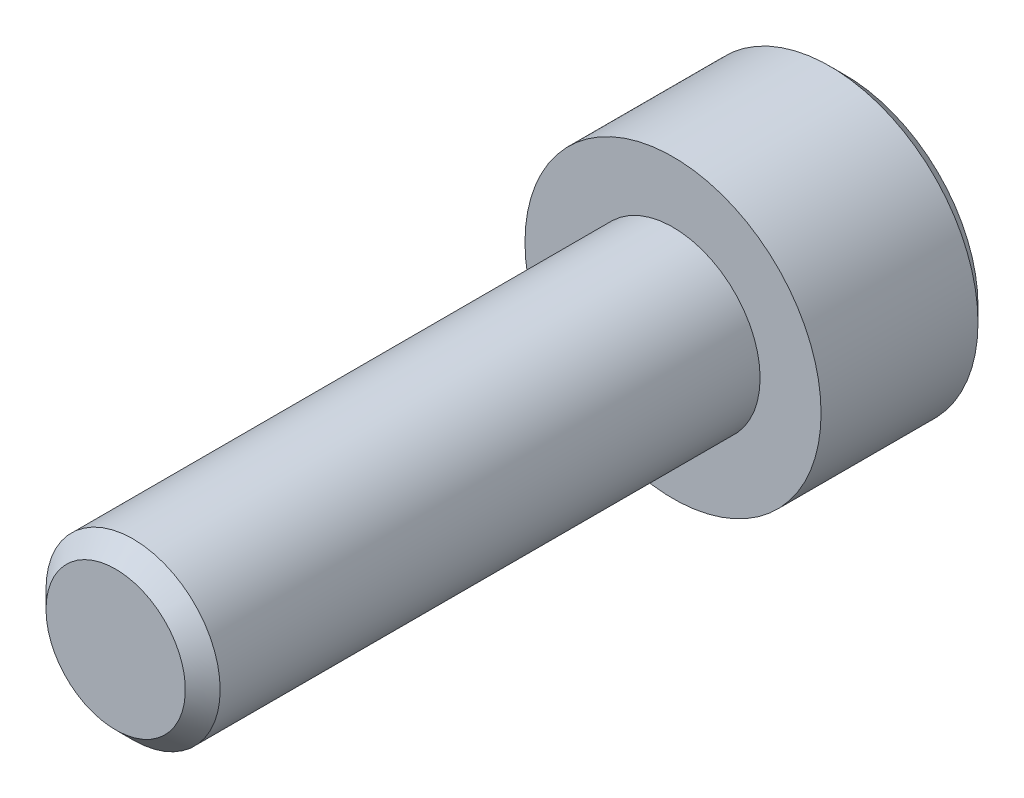
ISO-10303-21;
HEADER;
FILE_DESCRIPTION(('STEP AP214'),'2;1');
FILE_NAME('part.step','',(''),(''),'','','');
FILE_SCHEMA(('AUTOMOTIVE_DESIGN { 1 0 10303 214 1 1 1 1 }'));
ENDSEC;
DATA;
#1=APPLICATION_CONTEXT('core data for automotive mechanical design processes');
#2=APPLICATION_PROTOCOL_DEFINITION('international standard','automotive_design',2000,#1);
#3=PRODUCT_CONTEXT('',#1,'mechanical');
#4=PRODUCT('Part','Part','',(#3));
#5=PRODUCT_RELATED_PRODUCT_CATEGORY('part','',(#4));
#6=PRODUCT_DEFINITION_FORMATION('','',#4);
#7=PRODUCT_DEFINITION_CONTEXT('part definition',#1,'design');
#8=PRODUCT_DEFINITION('design','',#6,#7);
#9=PRODUCT_DEFINITION_SHAPE('','',#8);
#10=(LENGTH_UNIT() NAMED_UNIT(*) SI_UNIT(.MILLI.,.METRE.));
#11=(NAMED_UNIT(*) PLANE_ANGLE_UNIT() SI_UNIT($,.RADIAN.));
#12=(NAMED_UNIT(*) SI_UNIT($,.STERADIAN.) SOLID_ANGLE_UNIT());
#13=UNCERTAINTY_MEASURE_WITH_UNIT(LENGTH_MEASURE(1.E-05),#10,'distance_accuracy_value','');
#14=(GEOMETRIC_REPRESENTATION_CONTEXT(3) GLOBAL_UNCERTAINTY_ASSIGNED_CONTEXT((#13)) GLOBAL_UNIT_ASSIGNED_CONTEXT((#10,
#11,#12)) REPRESENTATION_CONTEXT('',''));
#15=CARTESIAN_POINT('',(0.,0.,0.));
#16=DIRECTION('',(0.,0.,1.));
#17=DIRECTION('',(1.,0.,0.));
#18=AXIS2_PLACEMENT_3D('',#15,#16,#17);
#19=CARTESIAN_POINT('',(0.,0.,-2.43));
#20=DIRECTION('',(0.,0.,1.));
#21=DIRECTION('',(1.,0.,0.));
#22=AXIS2_PLACEMENT_3D('',#19,#20,#21);
#23=PLANE('',#22);
#24=DIRECTION('',(0.,1.,0.));
#25=VECTOR('',#24,1.);
#26=CARTESIAN_POINT('',(2.,1.15470053837925,-2.43));
#27=LINE('',#26,#25);
#28=CARTESIAN_POINT('',(2.,1.15470053837925,-2.43));
#29=VERTEX_POINT('',#28);
#30=CARTESIAN_POINT('',(2.,-1.15470053837925,-2.43));
#31=VERTEX_POINT('',#30);
#32=EDGE_CURVE('E130',#29,#31,#27,.F.);
#33=ORIENTED_EDGE('',*,*,#32,.T.);
#34=DIRECTION('',(0.866025403784439,0.499999999999999,0.));
#35=VECTOR('',#34,1.);
#36=CARTESIAN_POINT('',(2.,-1.15470053837925,-2.43));
#37=LINE('',#36,#35);
#38=CARTESIAN_POINT('',(0.,-2.3094010767585,-2.43));
#39=VERTEX_POINT('',#38);
#40=EDGE_CURVE('E125',#31,#39,#37,.F.);
#41=ORIENTED_EDGE('',*,*,#40,.T.);
#42=DIRECTION('',(0.866025403784438,-0.5,0.));
#43=VECTOR('',#42,1.);
#44=CARTESIAN_POINT('',(0.,-2.3094010767585,-2.43));
#45=LINE('',#44,#43);
#46=CARTESIAN_POINT('',(-2.,-1.15470053837925,-2.43));
#47=VERTEX_POINT('',#46);
#48=EDGE_CURVE('E74',#39,#47,#45,.F.);
#49=ORIENTED_EDGE('',*,*,#48,.T.);
#50=DIRECTION('',(0.,1.,0.));
#51=VECTOR('',#50,1.);
#52=CARTESIAN_POINT('',(-2.,-1.15470053837925,-2.43));
#53=LINE('',#52,#51);
#54=CARTESIAN_POINT('',(-2.,1.15470053837925,-2.43));
#55=VERTEX_POINT('',#54);
#56=EDGE_CURVE('E71',#47,#55,#53,.T.);
#57=ORIENTED_EDGE('',*,*,#56,.T.);
#58=DIRECTION('',(-0.866025403784439,-0.5,0.));
#59=VECTOR('',#58,1.);
#60=CARTESIAN_POINT('',(-2.,1.15470053837925,-2.43));
#61=LINE('',#60,#59);
#62=CARTESIAN_POINT('',(0.,2.3094010767585,-2.43));
#63=VERTEX_POINT('',#62);
#64=EDGE_CURVE('E68',#55,#63,#61,.F.);
#65=ORIENTED_EDGE('',*,*,#64,.T.);
#66=DIRECTION('',(-0.866025403784439,0.5,0.));
#67=VECTOR('',#66,1.);
#68=CARTESIAN_POINT('',(0.,2.3094010767585,-2.43));
#69=LINE('',#68,#67);
#70=EDGE_CURVE('E91',#63,#29,#69,.F.);
#71=ORIENTED_EDGE('',*,*,#70,.T.);
#72=EDGE_LOOP('',(#33,#41,#49,#57,#65,#71));
#73=FACE_BOUND('',#72,.T.);
#74=ADVANCED_FACE('F17',(#73),#23,.F.);
#75=CARTESIAN_POINT('',(-2.,-1.15470053837925,-4.93));
#76=DIRECTION('',(-1.,0.,0.));
#77=DIRECTION('',(0.,0.,1.));
#78=AXIS2_PLACEMENT_3D('',#75,#76,#77);
#79=PLANE('',#78);
#80=ORIENTED_EDGE('',*,*,#56,.F.);
#81=DIRECTION('',(0.,0.,1.));
#82=VECTOR('',#81,1.);
#83=CARTESIAN_POINT('',(-2.,-1.15470053837925,-4.93));
#84=LINE('',#83,#82);
#85=CARTESIAN_POINT('',(-2.,-1.15470053837925,-4.93));
#86=VERTEX_POINT('',#85);
#87=EDGE_CURVE('E120',#47,#86,#84,.F.);
#88=ORIENTED_EDGE('',*,*,#87,.T.);
#89=DIRECTION('',(0.,1.,0.));
#90=VECTOR('',#89,1.);
#91=CARTESIAN_POINT('',(-2.,0.,-4.93));
#92=LINE('',#91,#90);
#93=CARTESIAN_POINT('',(-2.,1.15470053837925,-4.93));
#94=VERTEX_POINT('',#93);
#95=EDGE_CURVE('E82',#86,#94,#92,.T.);
#96=ORIENTED_EDGE('',*,*,#95,.T.);
#97=DIRECTION('',(0.,0.,1.));
#98=VECTOR('',#97,1.);
#99=CARTESIAN_POINT('',(-2.,1.15470053837925,-4.93));
#100=LINE('',#99,#98);
#101=EDGE_CURVE('E77',#94,#55,#100,.T.);
#102=ORIENTED_EDGE('',*,*,#101,.T.);
#103=EDGE_LOOP('',(#80,#88,#96,#102));
#104=FACE_BOUND('',#103,.T.);
#105=ADVANCED_FACE('F80',(#104),#79,.F.);
#106=CARTESIAN_POINT('',(-2.,1.15470053837925,-4.93));
#107=DIRECTION('',(-0.5,0.866025403784439,0.));
#108=DIRECTION('',(-0.866025403784439,-0.5,0.));
#109=AXIS2_PLACEMENT_3D('',#106,#107,#108);
#110=PLANE('',#109);
#111=ORIENTED_EDGE('',*,*,#64,.F.);
#112=ORIENTED_EDGE('',*,*,#101,.F.);
#113=DIRECTION('',(0.866025403784439,0.499999999999999,0.));
#114=VECTOR('',#113,1.);
#115=CARTESIAN_POINT('',(-2.,1.15470053837925,-4.93));
#116=LINE('',#115,#114);
#117=CARTESIAN_POINT('',(0.,2.3094010767585,-4.93));
#118=VERTEX_POINT('',#117);
#119=EDGE_CURVE('E117',#94,#118,#116,.T.);
#120=ORIENTED_EDGE('',*,*,#119,.T.);
#121=DIRECTION('',(0.,0.,1.));
#122=VECTOR('',#121,1.);
#123=CARTESIAN_POINT('',(0.,2.3094010767585,-4.93));
#124=LINE('',#123,#122);
#125=EDGE_CURVE('E88',#118,#63,#124,.T.);
#126=ORIENTED_EDGE('',*,*,#125,.T.);
#127=EDGE_LOOP('',(#111,#112,#120,#126));
#128=FACE_BOUND('',#127,.T.);
#129=ADVANCED_FACE('F86',(#128),#110,.F.);
#130=CARTESIAN_POINT('',(0.,2.3094010767585,-4.93));
#131=DIRECTION('',(0.5,0.866025403784439,0.));
#132=DIRECTION('',(-0.866025403784439,0.5,0.));
#133=AXIS2_PLACEMENT_3D('',#130,#131,#132);
#134=PLANE('',#133);
#135=ORIENTED_EDGE('',*,*,#70,.F.);
#136=ORIENTED_EDGE('',*,*,#125,.F.);
#137=DIRECTION('',(0.866025403784439,-0.5,0.));
#138=VECTOR('',#137,1.);
#139=CARTESIAN_POINT('',(0.,2.3094010767585,-4.93));
#140=LINE('',#139,#138);
#141=CARTESIAN_POINT('',(2.,1.15470053837925,-4.93));
#142=VERTEX_POINT('',#141);
#143=EDGE_CURVE('E115',#118,#142,#140,.T.);
#144=ORIENTED_EDGE('',*,*,#143,.T.);
#145=DIRECTION('',(0.,0.,-1.));
#146=VECTOR('',#145,1.);
#147=CARTESIAN_POINT('',(2.,1.15470053837925,-4.93));
#148=LINE('',#147,#146);
#149=EDGE_CURVE('E132',#142,#29,#148,.F.);
#150=ORIENTED_EDGE('',*,*,#149,.T.);
#151=EDGE_LOOP('',(#135,#136,#144,#150));
#152=FACE_BOUND('',#151,.T.);
#153=ADVANCED_FACE('F137',(#152),#134,.F.);
#154=CARTESIAN_POINT('',(2.,1.15470053837925,-4.93));
#155=DIRECTION('',(1.,0.,0.));
#156=DIRECTION('',(0.,0.,-1.));
#157=AXIS2_PLACEMENT_3D('',#154,#155,#156);
#158=PLANE('',#157);
#159=ORIENTED_EDGE('',*,*,#32,.F.);
#160=ORIENTED_EDGE('',*,*,#149,.F.);
#161=DIRECTION('',(0.,1.,0.));
#162=VECTOR('',#161,1.);
#163=CARTESIAN_POINT('',(2.,0.,-4.93));
#164=LINE('',#163,#162);
#165=CARTESIAN_POINT('',(2.,-1.15470053837925,-4.93));
#166=VERTEX_POINT('',#165);
#167=EDGE_CURVE('E113',#142,#166,#164,.F.);
#168=ORIENTED_EDGE('',*,*,#167,.T.);
#169=DIRECTION('',(0.,0.,1.));
#170=VECTOR('',#169,1.);
#171=CARTESIAN_POINT('',(2.,-1.15470053837925,-4.93));
#172=LINE('',#171,#170);
#173=EDGE_CURVE('E127',#166,#31,#172,.T.);
#174=ORIENTED_EDGE('',*,*,#173,.T.);
#175=EDGE_LOOP('',(#159,#160,#168,#174));
#176=FACE_BOUND('',#175,.T.);
#177=ADVANCED_FACE('F141',(#176),#158,.F.);
#178=CARTESIAN_POINT('',(2.,-1.15470053837925,-4.93));
#179=DIRECTION('',(0.499999999999999,-0.866025403784439,0.));
#180=DIRECTION('',(0.866025403784439,0.499999999999999,0.));
#181=AXIS2_PLACEMENT_3D('',#178,#179,#180);
#182=PLANE('',#181);
#183=ORIENTED_EDGE('',*,*,#40,.F.);
#184=ORIENTED_EDGE('',*,*,#173,.F.);
#185=DIRECTION('',(-0.866025403784439,-0.499999999999999,0.));
#186=VECTOR('',#185,1.);
#187=CARTESIAN_POINT('',(2.,-1.15470053837925,-4.93));
#188=LINE('',#187,#186);
#189=CARTESIAN_POINT('',(0.,-2.3094010767585,-4.93));
#190=VERTEX_POINT('',#189);
#191=EDGE_CURVE('E35',#166,#190,#188,.T.);
#192=ORIENTED_EDGE('',*,*,#191,.T.);
#193=DIRECTION('',(0.,0.,1.));
#194=VECTOR('',#193,1.);
#195=CARTESIAN_POINT('',(0.,-2.3094010767585,-4.93));
#196=LINE('',#195,#194);
#197=EDGE_CURVE('E123',#190,#39,#196,.T.);
#198=ORIENTED_EDGE('',*,*,#197,.T.);
#199=EDGE_LOOP('',(#183,#184,#192,#198));
#200=FACE_BOUND('',#199,.T.);
#201=ADVANCED_FACE('F143',(#200),#182,.F.);
#202=CARTESIAN_POINT('',(0.,-2.3094010767585,-4.93));
#203=DIRECTION('',(-0.5,-0.866025403784438,0.));
#204=DIRECTION('',(0.866025403784438,-0.5,0.));
#205=AXIS2_PLACEMENT_3D('',#202,#203,#204);
#206=PLANE('',#205);
#207=ORIENTED_EDGE('',*,*,#48,.F.);
#208=ORIENTED_EDGE('',*,*,#197,.F.);
#209=DIRECTION('',(-0.866025403784439,0.5,0.));
#210=VECTOR('',#209,1.);
#211=CARTESIAN_POINT('',(0.,-2.3094010767585,-4.93));
#212=LINE('',#211,#210);
#213=EDGE_CURVE('E107',#190,#86,#212,.T.);
#214=ORIENTED_EDGE('',*,*,#213,.T.);
#215=ORIENTED_EDGE('',*,*,#87,.F.);
#216=EDGE_LOOP('',(#207,#208,#214,#215));
#217=FACE_BOUND('',#216,.T.);
#218=ADVANCED_FACE('F146',(#217),#206,.F.);
#219=CARTESIAN_POINT('',(0.,0.,-4.93));
#220=DIRECTION('',(0.,0.,1.));
#221=DIRECTION('',(1.,0.,0.));
#222=AXIS2_PLACEMENT_3D('',#219,#220,#221);
#223=PLANE('',#222);
#224=ORIENTED_EDGE('',*,*,#191,.F.);
#225=ORIENTED_EDGE('',*,*,#167,.F.);
#226=ORIENTED_EDGE('',*,*,#143,.F.);
#227=ORIENTED_EDGE('',*,*,#119,.F.);
#228=ORIENTED_EDGE('',*,*,#95,.F.);
#229=ORIENTED_EDGE('',*,*,#213,.F.);
#230=EDGE_LOOP('',(#224,#225,#226,#227,#228,#229));
#231=FACE_BOUND('',#230,.T.);
#232=CARTESIAN_POINT('',(0.,0.,-4.9300000000585));
#233=DIRECTION('',(0.,0.,1.));
#234=DIRECTION('',(1.,0.,0.));
#235=AXIS2_PLACEMENT_3D('',#232,#233,#234);
#236=CIRCLE('',#235,3.82500000000618);
#237=CARTESIAN_POINT('',(3.82500000000618,0.,-4.9300000000585));
#238=VERTEX_POINT('',#237);
#239=EDGE_CURVE('E20',#238,#238,#236,.T.);
#240=ORIENTED_EDGE('',*,*,#239,.F.);
#241=EDGE_LOOP('',(#240));
#242=FACE_BOUND('',#241,.T.);
#243=ADVANCED_FACE('F148',(#231,#242),#223,.F.);
#244=CARTESIAN_POINT('',(0.,0.,-4.50499999999465));
#245=DIRECTION('',(0.,0.,1.));
#246=DIRECTION('',(1.,0.,0.));
#247=AXIS2_PLACEMENT_3D('',#244,#245,#246);
#248=CONICAL_SURFACE('',#247,4.25000000007003,0.785398163397448);
#249=ORIENTED_EDGE('',*,*,#239,.T.);
#250=EDGE_LOOP('',(#249));
#251=FACE_BOUND('',#250,.T.);
#252=CARTESIAN_POINT('',(0.,0.,-4.505));
#253=DIRECTION('',(0.,0.,1.));
#254=DIRECTION('',(1.,0.,0.));
#255=AXIS2_PLACEMENT_3D('',#252,#253,#254);
#256=CIRCLE('',#255,4.25);
#257=CARTESIAN_POINT('',(4.25,0.,-4.505));
#258=VERTEX_POINT('',#257);
#259=EDGE_CURVE('E99',#258,#258,#256,.T.);
#260=ORIENTED_EDGE('',*,*,#259,.F.);
#261=EDGE_LOOP('',(#260));
#262=FACE_BOUND('',#261,.T.);
#263=ADVANCED_FACE('F151',(#251,#262),#248,.T.);
#264=CARTESIAN_POINT('',(0.,0.,16.));
#265=DIRECTION('',(0.,0.,1.));
#266=DIRECTION('',(1.,0.,0.));
#267=AXIS2_PLACEMENT_3D('',#264,#265,#266);
#268=PLANE('',#267);
#269=CARTESIAN_POINT('',(0.,0.,16.0000000000196));
#270=DIRECTION('',(0.,0.,-1.));
#271=DIRECTION('',(-1.,0.,0.));
#272=AXIS2_PLACEMENT_3D('',#269,#270,#271);
#273=CIRCLE('',#272,1.99999999995271);
#274=CARTESIAN_POINT('',(-1.99999999995271,0.,16.0000000000196));
#275=VERTEX_POINT('',#274);
#276=EDGE_CURVE('E97',#275,#275,#273,.T.);
#277=ORIENTED_EDGE('',*,*,#276,.F.);
#278=EDGE_LOOP('',(#277));
#279=FACE_BOUND('',#278,.T.);
#280=ADVANCED_FACE('F157',(#279),#268,.T.);
#281=CARTESIAN_POINT('',(0.,0.,-4.93));
#282=DIRECTION('',(0.,0.,1.));
#283=DIRECTION('',(1.,0.,0.));
#284=AXIS2_PLACEMENT_3D('',#281,#282,#283);
#285=CYLINDRICAL_SURFACE('',#284,4.25);
#286=ORIENTED_EDGE('',*,*,#259,.T.);
#287=EDGE_LOOP('',(#286));
#288=FACE_BOUND('',#287,.T.);
#289=CARTESIAN_POINT('',(0.,0.,0.));
#290=DIRECTION('',(0.,0.,1.));
#291=DIRECTION('',(1.,0.,0.));
#292=AXIS2_PLACEMENT_3D('',#289,#290,#291);
#293=CIRCLE('',#292,4.25);
#294=CARTESIAN_POINT('',(4.25,0.,0.));
#295=VERTEX_POINT('',#294);
#296=EDGE_CURVE('E95',#295,#295,#293,.T.);
#297=ORIENTED_EDGE('',*,*,#296,.F.);
#298=EDGE_LOOP('',(#297));
#299=FACE_BOUND('',#298,.T.);
#300=ADVANCED_FACE('F163',(#288,#299),#285,.T.);
#301=CARTESIAN_POINT('',(0.,0.,15.4999999999177));
#302=DIRECTION('',(0.,0.,-1.));
#303=DIRECTION('',(-1.,0.,0.));
#304=AXIS2_PLACEMENT_3D('',#301,#302,#303);
#305=CONICAL_SURFACE('',#304,2.50000000005457,0.785398163397448);
#306=CARTESIAN_POINT('',(0.,0.,15.5));
#307=DIRECTION('',(0.,0.,1.));
#308=DIRECTION('',(1.,0.,0.));
#309=AXIS2_PLACEMENT_3D('',#306,#307,#308);
#310=CIRCLE('',#309,2.5);
#311=CARTESIAN_POINT('',(2.5,0.,15.5));
#312=VERTEX_POINT('',#311);
#313=EDGE_CURVE('E26',#312,#312,#310,.F.);
#314=ORIENTED_EDGE('',*,*,#313,.F.);
#315=EDGE_LOOP('',(#314));
#316=FACE_BOUND('',#315,.T.);
#317=ORIENTED_EDGE('',*,*,#276,.T.);
#318=EDGE_LOOP('',(#317));
#319=FACE_BOUND('',#318,.T.);
#320=ADVANCED_FACE('F174',(#316,#319),#305,.T.);
#321=CARTESIAN_POINT('',(0.,0.,0.));
#322=DIRECTION('',(0.,0.,1.));
#323=DIRECTION('',(1.,0.,0.));
#324=AXIS2_PLACEMENT_3D('',#321,#322,#323);
#325=PLANE('',#324);
#326=ORIENTED_EDGE('',*,*,#296,.T.);
#327=EDGE_LOOP('',(#326));
#328=FACE_BOUND('',#327,.T.);
#329=CARTESIAN_POINT('',(0.,0.,0.));
#330=DIRECTION('',(0.,0.,1.));
#331=DIRECTION('',(1.,0.,0.));
#332=AXIS2_PLACEMENT_3D('',#329,#330,#331);
#333=CIRCLE('',#332,2.5);
#334=CARTESIAN_POINT('',(2.5,0.,0.));
#335=VERTEX_POINT('',#334);
#336=EDGE_CURVE('E11',#335,#335,#333,.T.);
#337=ORIENTED_EDGE('',*,*,#336,.F.);
#338=EDGE_LOOP('',(#337));
#339=FACE_BOUND('',#338,.T.);
#340=ADVANCED_FACE('F168',(#328,#339),#325,.T.);
#341=CARTESIAN_POINT('',(0.,0.,0.));
#342=DIRECTION('',(0.,0.,1.));
#343=DIRECTION('',(1.,0.,0.));
#344=AXIS2_PLACEMENT_3D('',#341,#342,#343);
#345=CYLINDRICAL_SURFACE('',#344,2.5);
#346=ORIENTED_EDGE('',*,*,#336,.T.);
#347=EDGE_LOOP('',(#346));
#348=FACE_BOUND('',#347,.T.);
#349=ORIENTED_EDGE('',*,*,#313,.T.);
#350=EDGE_LOOP('',(#349));
#351=FACE_BOUND('',#350,.T.);
#352=ADVANCED_FACE('F166',(#348,#351),#345,.T.);
#353=CLOSED_SHELL('',(#74,#105,#129,#153,#177,#201,#218,#243,#263,#280,#300,#320,#340,#352));
#354=MANIFOLD_SOLID_BREP('B1',#353);
#355=ADVANCED_BREP_SHAPE_REPRESENTATION('',(#18,#354),#14);
#356=SHAPE_DEFINITION_REPRESENTATION(#9,#355);
ENDSEC;
END-ISO-10303-21;
